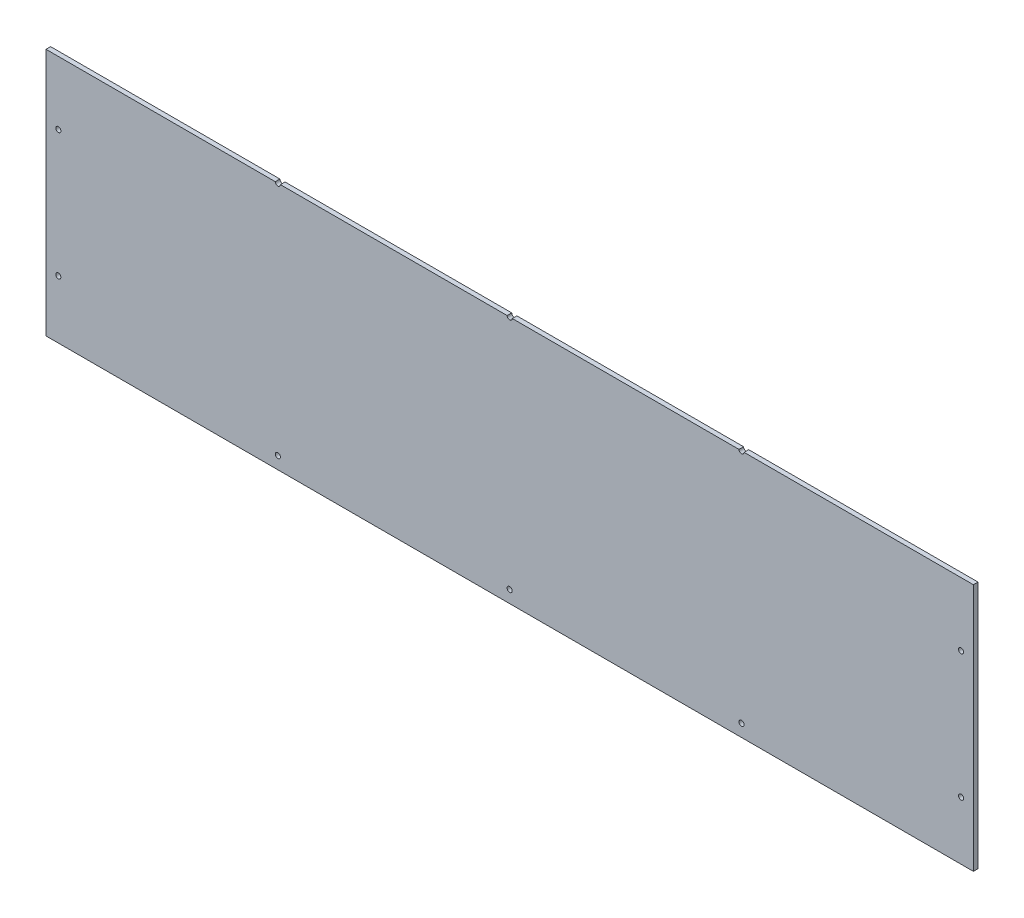
ISO-10303-21;
HEADER;
FILE_DESCRIPTION(('STEP AP214'),'2;1');
FILE_NAME('part.step','',(''),(''),'','','');
FILE_SCHEMA(('AUTOMOTIVE_DESIGN { 1 0 10303 214 1 1 1 1 }'));
ENDSEC;
DATA;
#1=APPLICATION_CONTEXT('core data for automotive mechanical design processes');
#2=APPLICATION_PROTOCOL_DEFINITION('international standard','automotive_design',2000,#1);
#3=PRODUCT_CONTEXT('',#1,'mechanical');
#4=PRODUCT('Part','Part','',(#3));
#5=PRODUCT_RELATED_PRODUCT_CATEGORY('part','',(#4));
#6=PRODUCT_DEFINITION_FORMATION('','',#4);
#7=PRODUCT_DEFINITION_CONTEXT('part definition',#1,'design');
#8=PRODUCT_DEFINITION('design','',#6,#7);
#9=PRODUCT_DEFINITION_SHAPE('','',#8);
#10=(LENGTH_UNIT() NAMED_UNIT(*) SI_UNIT(.MILLI.,.METRE.));
#11=(NAMED_UNIT(*) PLANE_ANGLE_UNIT() SI_UNIT($,.RADIAN.));
#12=(NAMED_UNIT(*) SI_UNIT($,.STERADIAN.) SOLID_ANGLE_UNIT());
#13=UNCERTAINTY_MEASURE_WITH_UNIT(LENGTH_MEASURE(1.E-05),#10,'distance_accuracy_value','');
#14=(GEOMETRIC_REPRESENTATION_CONTEXT(3) GLOBAL_UNCERTAINTY_ASSIGNED_CONTEXT((#13)) GLOBAL_UNIT_ASSIGNED_CONTEXT((#10,
#11,#12)) REPRESENTATION_CONTEXT('',''));
#15=CARTESIAN_POINT('',(0.,0.,0.));
#16=DIRECTION('',(0.,0.,1.));
#17=DIRECTION('',(1.,0.,0.));
#18=AXIS2_PLACEMENT_3D('',#15,#16,#17);
#19=CARTESIAN_POINT('',(-226.,123.499999999998,4.5));
#20=DIRECTION('',(0.,0.,1.));
#21=DIRECTION('',(1.,0.,0.));
#22=AXIS2_PLACEMENT_3D('',#19,#20,#21);
#23=PLANE('',#22);
#24=CARTESIAN_POINT('',(226.,-106.499999999998,4.5));
#25=DIRECTION('',(0.,0.,1.));
#26=DIRECTION('',(1.,0.,0.));
#27=AXIS2_PLACEMENT_3D('',#24,#25,#26);
#28=CIRCLE('',#27,2.5);
#29=CARTESIAN_POINT('',(228.5,-106.499999999998,4.5));
#30=VERTEX_POINT('',#29);
#31=EDGE_CURVE('E281',#30,#30,#28,.T.);
#32=ORIENTED_EDGE('',*,*,#31,.F.);
#33=EDGE_LOOP('',(#32));
#34=FACE_BOUND('',#33,.T.);
#35=CARTESIAN_POINT('',(440.,61.7500000000001,4.5));
#36=DIRECTION('',(0.,0.,1.));
#37=DIRECTION('',(-1.,0.,0.));
#38=AXIS2_PLACEMENT_3D('',#35,#36,#37);
#39=CIRCLE('',#38,2.50000000000002);
#40=CARTESIAN_POINT('',(437.5,61.7500000000001,4.5));
#41=VERTEX_POINT('',#40);
#42=EDGE_CURVE('E265',#41,#41,#39,.T.);
#43=ORIENTED_EDGE('',*,*,#42,.F.);
#44=EDGE_LOOP('',(#43));
#45=FACE_BOUND('',#44,.T.);
#46=CARTESIAN_POINT('',(439.999999999999,-61.7499999999999,4.5));
#47=DIRECTION('',(0.,0.,1.));
#48=DIRECTION('',(-1.,0.,0.));
#49=AXIS2_PLACEMENT_3D('',#46,#47,#48);
#50=CIRCLE('',#49,2.50000000000002);
#51=CARTESIAN_POINT('',(437.499999999999,-61.7499999999999,4.5));
#52=VERTEX_POINT('',#51);
#53=EDGE_CURVE('E249',#52,#52,#50,.T.);
#54=ORIENTED_EDGE('',*,*,#53,.F.);
#55=EDGE_LOOP('',(#54));
#56=FACE_BOUND('',#55,.T.);
#57=DIRECTION('',(-1.,0.,0.));
#58=VECTOR('',#57,1.);
#59=CARTESIAN_POINT('',(-452.000000000001,123.499999999997,4.5));
#60=LINE('',#59,#58);
#61=CARTESIAN_POINT('',(-228.5,123.499999999998,4.5));
#62=VERTEX_POINT('',#61);
#63=CARTESIAN_POINT('',(-452.000000000001,123.499999999997,4.5));
#64=VERTEX_POINT('',#63);
#65=EDGE_CURVE('E182',#62,#64,#60,.T.);
#66=ORIENTED_EDGE('',*,*,#65,.T.);
#67=DIRECTION('',(0.,-1.,0.));
#68=VECTOR('',#67,1.);
#69=CARTESIAN_POINT('',(-452.000000000001,123.499999999997,4.5));
#70=LINE('',#69,#68);
#71=CARTESIAN_POINT('',(-451.999999999999,-118.5,4.5));
#72=VERTEX_POINT('',#71);
#73=EDGE_CURVE('E106',#64,#72,#70,.T.);
#74=ORIENTED_EDGE('',*,*,#73,.T.);
#75=DIRECTION('',(1.,0.,0.));
#76=VECTOR('',#75,1.);
#77=CARTESIAN_POINT('',(-451.999999999999,-118.5,4.5));
#78=LINE('',#77,#76);
#79=CARTESIAN_POINT('',(452.000000000001,-118.499999999997,4.5));
#80=VERTEX_POINT('',#79);
#81=EDGE_CURVE('E211',#72,#80,#78,.T.);
#82=ORIENTED_EDGE('',*,*,#81,.T.);
#83=DIRECTION('',(0.,1.,0.));
#84=VECTOR('',#83,1.);
#85=CARTESIAN_POINT('',(451.999999999999,123.500000000003,4.5));
#86=LINE('',#85,#84);
#87=CARTESIAN_POINT('',(451.999999999999,123.500000000003,4.5));
#88=VERTEX_POINT('',#87);
#89=EDGE_CURVE('E231',#80,#88,#86,.T.);
#90=ORIENTED_EDGE('',*,*,#89,.T.);
#91=DIRECTION('',(-1.,0.,0.));
#92=VECTOR('',#91,1.);
#93=CARTESIAN_POINT('',(228.5,123.5,4.5));
#94=LINE('',#93,#92);
#95=CARTESIAN_POINT('',(228.5,123.5,4.5));
#96=VERTEX_POINT('',#95);
#97=EDGE_CURVE('E227',#88,#96,#94,.T.);
#98=ORIENTED_EDGE('',*,*,#97,.T.);
#99=CARTESIAN_POINT('',(226.,123.5,4.5));
#100=DIRECTION('',(0.,0.,-1.));
#101=DIRECTION('',(1.,0.,0.));
#102=AXIS2_PLACEMENT_3D('',#99,#100,#101);
#103=CIRCLE('',#102,2.5);
#104=CARTESIAN_POINT('',(223.5,123.5,4.5));
#105=VERTEX_POINT('',#104);
#106=EDGE_CURVE('E230',#96,#105,#103,.T.);
#107=ORIENTED_EDGE('',*,*,#106,.T.);
#108=DIRECTION('',(-1.,0.,0.));
#109=VECTOR('',#108,1.);
#110=CARTESIAN_POINT('',(2.50000000000006,123.5,4.5));
#111=LINE('',#110,#109);
#112=CARTESIAN_POINT('',(2.50000000000006,123.5,4.5));
#113=VERTEX_POINT('',#112);
#114=EDGE_CURVE('E131',#105,#113,#111,.T.);
#115=ORIENTED_EDGE('',*,*,#114,.T.);
#116=CARTESIAN_POINT('',(-7.51373588231738E-13,123.5,4.5));
#117=DIRECTION('',(0.,0.,-1.));
#118=DIRECTION('',(1.,0.,0.));
#119=AXIS2_PLACEMENT_3D('',#116,#117,#118);
#120=CIRCLE('',#119,2.5);
#121=CARTESIAN_POINT('',(-2.50000000000075,123.5,4.5));
#122=VERTEX_POINT('',#121);
#123=EDGE_CURVE('E125',#113,#122,#120,.T.);
#124=ORIENTED_EDGE('',*,*,#123,.T.);
#125=DIRECTION('',(-1.,0.,0.));
#126=VECTOR('',#125,1.);
#127=CARTESIAN_POINT('',(-223.5,123.499999999998,4.5));
#128=LINE('',#127,#126);
#129=CARTESIAN_POINT('',(-223.5,123.499999999998,4.5));
#130=VERTEX_POINT('',#129);
#131=EDGE_CURVE('E129',#122,#130,#128,.T.);
#132=ORIENTED_EDGE('',*,*,#131,.T.);
#133=CARTESIAN_POINT('',(-226.,123.499999999998,4.5));
#134=DIRECTION('',(0.,0.,-1.));
#135=DIRECTION('',(1.,0.,0.));
#136=AXIS2_PLACEMENT_3D('',#133,#134,#135);
#137=CIRCLE('',#136,2.5);
#138=EDGE_CURVE('E57',#130,#62,#137,.T.);
#139=ORIENTED_EDGE('',*,*,#138,.T.);
#140=EDGE_LOOP('',(#66,#74,#82,#90,#98,#107,#115,#124,#132,#139));
#141=FACE_BOUND('',#140,.T.);
#142=CARTESIAN_POINT('',(-440.,61.7500000000001,4.5));
#143=DIRECTION('',(0.,0.,1.));
#144=DIRECTION('',(1.,0.,0.));
#145=AXIS2_PLACEMENT_3D('',#142,#143,#144);
#146=CIRCLE('',#145,2.50000000000002);
#147=CARTESIAN_POINT('',(-437.5,61.7500000000001,4.5));
#148=VERTEX_POINT('',#147);
#149=EDGE_CURVE('E158',#148,#148,#146,.T.);
#150=ORIENTED_EDGE('',*,*,#149,.F.);
#151=EDGE_LOOP('',(#150));
#152=FACE_BOUND('',#151,.T.);
#153=CARTESIAN_POINT('',(-439.999999999999,-61.7499999999999,4.5));
#154=DIRECTION('',(0.,0.,1.));
#155=DIRECTION('',(1.,0.,0.));
#156=AXIS2_PLACEMENT_3D('',#153,#154,#155);
#157=CIRCLE('',#156,2.50000000000002);
#158=CARTESIAN_POINT('',(-437.499999999999,-61.7499999999999,4.5));
#159=VERTEX_POINT('',#158);
#160=EDGE_CURVE('E257',#159,#159,#157,.T.);
#161=ORIENTED_EDGE('',*,*,#160,.F.);
#162=EDGE_LOOP('',(#161));
#163=FACE_BOUND('',#162,.T.);
#164=CARTESIAN_POINT('',(0.,-106.499999999998,4.5));
#165=DIRECTION('',(0.,0.,1.));
#166=DIRECTION('',(1.,0.,0.));
#167=AXIS2_PLACEMENT_3D('',#164,#165,#166);
#168=CIRCLE('',#167,2.5);
#169=CARTESIAN_POINT('',(2.50000000000005,-106.499999999998,4.5));
#170=VERTEX_POINT('',#169);
#171=EDGE_CURVE('E273',#170,#170,#168,.T.);
#172=ORIENTED_EDGE('',*,*,#171,.F.);
#173=EDGE_LOOP('',(#172));
#174=FACE_BOUND('',#173,.T.);
#175=CARTESIAN_POINT('',(-226.,-106.5,4.5));
#176=DIRECTION('',(0.,0.,1.));
#177=DIRECTION('',(1.,0.,0.));
#178=AXIS2_PLACEMENT_3D('',#175,#176,#177);
#179=CIRCLE('',#178,2.5);
#180=CARTESIAN_POINT('',(-223.5,-106.5,4.5));
#181=VERTEX_POINT('',#180);
#182=EDGE_CURVE('E289',#181,#181,#179,.T.);
#183=ORIENTED_EDGE('',*,*,#182,.F.);
#184=EDGE_LOOP('',(#183));
#185=FACE_BOUND('',#184,.T.);
#186=ADVANCED_FACE('F39',(#34,#45,#56,#141,#152,#163,#174,#185),#23,.T.);
#187=CARTESIAN_POINT('',(-226.,123.499999999998,0.));
#188=DIRECTION('',(0.,0.,1.));
#189=DIRECTION('',(1.,0.,0.));
#190=AXIS2_PLACEMENT_3D('',#187,#188,#189);
#191=PLANE('',#190);
#192=DIRECTION('',(-1.,0.,0.));
#193=VECTOR('',#192,1.);
#194=CARTESIAN_POINT('',(-452.000000000001,123.499999999997,0.));
#195=LINE('',#194,#193);
#196=CARTESIAN_POINT('',(-228.5,123.499999999998,0.));
#197=VERTEX_POINT('',#196);
#198=CARTESIAN_POINT('',(-452.000000000001,123.499999999997,0.));
#199=VERTEX_POINT('',#198);
#200=EDGE_CURVE('E153',#197,#199,#195,.T.);
#201=ORIENTED_EDGE('',*,*,#200,.F.);
#202=CARTESIAN_POINT('',(-226.,123.499999999998,0.));
#203=DIRECTION('',(0.,0.,-1.));
#204=DIRECTION('',(1.,0.,0.));
#205=AXIS2_PLACEMENT_3D('',#202,#203,#204);
#206=CIRCLE('',#205,2.5);
#207=CARTESIAN_POINT('',(-223.5,123.499999999998,0.));
#208=VERTEX_POINT('',#207);
#209=EDGE_CURVE('E98',#208,#197,#206,.T.);
#210=ORIENTED_EDGE('',*,*,#209,.F.);
#211=DIRECTION('',(-1.,0.,0.));
#212=VECTOR('',#211,1.);
#213=CARTESIAN_POINT('',(-223.5,123.499999999998,0.));
#214=LINE('',#213,#212);
#215=CARTESIAN_POINT('',(-2.50000000000075,123.5,0.));
#216=VERTEX_POINT('',#215);
#217=EDGE_CURVE('E92',#216,#208,#214,.T.);
#218=ORIENTED_EDGE('',*,*,#217,.F.);
#219=CARTESIAN_POINT('',(-7.51373588231738E-13,123.5,0.));
#220=DIRECTION('',(0.,0.,-1.));
#221=DIRECTION('',(1.,0.,0.));
#222=AXIS2_PLACEMENT_3D('',#219,#220,#221);
#223=CIRCLE('',#222,2.5);
#224=CARTESIAN_POINT('',(2.50000000000006,123.5,0.));
#225=VERTEX_POINT('',#224);
#226=EDGE_CURVE('E140',#225,#216,#223,.T.);
#227=ORIENTED_EDGE('',*,*,#226,.F.);
#228=DIRECTION('',(-1.,0.,0.));
#229=VECTOR('',#228,1.);
#230=CARTESIAN_POINT('',(2.50000000000006,123.5,0.));
#231=LINE('',#230,#229);
#232=CARTESIAN_POINT('',(223.5,123.5,0.));
#233=VERTEX_POINT('',#232);
#234=EDGE_CURVE('E173',#233,#225,#231,.T.);
#235=ORIENTED_EDGE('',*,*,#234,.F.);
#236=CARTESIAN_POINT('',(226.,123.5,0.));
#237=DIRECTION('',(0.,0.,-1.));
#238=DIRECTION('',(1.,0.,0.));
#239=AXIS2_PLACEMENT_3D('',#236,#237,#238);
#240=CIRCLE('',#239,2.5);
#241=CARTESIAN_POINT('',(228.5,123.5,0.));
#242=VERTEX_POINT('',#241);
#243=EDGE_CURVE('E170',#242,#233,#240,.T.);
#244=ORIENTED_EDGE('',*,*,#243,.F.);
#245=DIRECTION('',(-1.,0.,0.));
#246=VECTOR('',#245,1.);
#247=CARTESIAN_POINT('',(228.5,123.5,0.));
#248=LINE('',#247,#246);
#249=CARTESIAN_POINT('',(451.999999999999,123.500000000003,0.));
#250=VERTEX_POINT('',#249);
#251=EDGE_CURVE('E167',#250,#242,#248,.T.);
#252=ORIENTED_EDGE('',*,*,#251,.F.);
#253=DIRECTION('',(0.,1.,0.));
#254=VECTOR('',#253,1.);
#255=CARTESIAN_POINT('',(451.999999999999,123.500000000003,0.));
#256=LINE('',#255,#254);
#257=CARTESIAN_POINT('',(452.000000000001,-118.499999999997,0.));
#258=VERTEX_POINT('',#257);
#259=EDGE_CURVE('E164',#258,#250,#256,.T.);
#260=ORIENTED_EDGE('',*,*,#259,.F.);
#261=DIRECTION('',(1.,0.,0.));
#262=VECTOR('',#261,1.);
#263=CARTESIAN_POINT('',(-451.999999999999,-118.5,0.));
#264=LINE('',#263,#262);
#265=CARTESIAN_POINT('',(-451.999999999999,-118.5,0.));
#266=VERTEX_POINT('',#265);
#267=EDGE_CURVE('E161',#266,#258,#264,.T.);
#268=ORIENTED_EDGE('',*,*,#267,.F.);
#269=DIRECTION('',(0.,-1.,0.));
#270=VECTOR('',#269,1.);
#271=CARTESIAN_POINT('',(-452.000000000001,123.499999999997,0.));
#272=LINE('',#271,#270);
#273=EDGE_CURVE('E157',#199,#266,#272,.T.);
#274=ORIENTED_EDGE('',*,*,#273,.F.);
#275=EDGE_LOOP('',(#201,#210,#218,#227,#235,#244,#252,#260,#268,#274));
#276=FACE_BOUND('',#275,.T.);
#277=CARTESIAN_POINT('',(-440.,61.7500000000001,0.));
#278=DIRECTION('',(0.,0.,1.));
#279=DIRECTION('',(1.,0.,0.));
#280=AXIS2_PLACEMENT_3D('',#277,#278,#279);
#281=CIRCLE('',#280,2.50000000000002);
#282=CARTESIAN_POINT('',(-437.5,61.7500000000001,0.));
#283=VERTEX_POINT('',#282);
#284=EDGE_CURVE('E245',#283,#283,#281,.T.);
#285=ORIENTED_EDGE('',*,*,#284,.T.);
#286=EDGE_LOOP('',(#285));
#287=FACE_BOUND('',#286,.T.);
#288=CARTESIAN_POINT('',(439.999999999999,-61.7499999999999,0.));
#289=DIRECTION('',(0.,0.,1.));
#290=DIRECTION('',(-1.,0.,0.));
#291=AXIS2_PLACEMENT_3D('',#288,#289,#290);
#292=CIRCLE('',#291,2.50000000000002);
#293=CARTESIAN_POINT('',(437.499999999999,-61.7499999999999,0.));
#294=VERTEX_POINT('',#293);
#295=EDGE_CURVE('E253',#294,#294,#292,.T.);
#296=ORIENTED_EDGE('',*,*,#295,.T.);
#297=EDGE_LOOP('',(#296));
#298=FACE_BOUND('',#297,.T.);
#299=CARTESIAN_POINT('',(-439.999999999999,-61.7499999999999,0.));
#300=DIRECTION('',(0.,0.,1.));
#301=DIRECTION('',(1.,0.,0.));
#302=AXIS2_PLACEMENT_3D('',#299,#300,#301);
#303=CIRCLE('',#302,2.50000000000002);
#304=CARTESIAN_POINT('',(-437.499999999999,-61.7499999999999,0.));
#305=VERTEX_POINT('',#304);
#306=EDGE_CURVE('E261',#305,#305,#303,.T.);
#307=ORIENTED_EDGE('',*,*,#306,.T.);
#308=EDGE_LOOP('',(#307));
#309=FACE_BOUND('',#308,.T.);
#310=CARTESIAN_POINT('',(440.,61.7500000000001,0.));
#311=DIRECTION('',(0.,0.,1.));
#312=DIRECTION('',(-1.,0.,0.));
#313=AXIS2_PLACEMENT_3D('',#310,#311,#312);
#314=CIRCLE('',#313,2.50000000000002);
#315=CARTESIAN_POINT('',(437.5,61.7500000000001,0.));
#316=VERTEX_POINT('',#315);
#317=EDGE_CURVE('E269',#316,#316,#314,.T.);
#318=ORIENTED_EDGE('',*,*,#317,.T.);
#319=EDGE_LOOP('',(#318));
#320=FACE_BOUND('',#319,.T.);
#321=CARTESIAN_POINT('',(0.,-106.499999999998,0.));
#322=DIRECTION('',(0.,0.,1.));
#323=DIRECTION('',(1.,0.,0.));
#324=AXIS2_PLACEMENT_3D('',#321,#322,#323);
#325=CIRCLE('',#324,2.5);
#326=CARTESIAN_POINT('',(2.50000000000005,-106.499999999998,0.));
#327=VERTEX_POINT('',#326);
#328=EDGE_CURVE('E277',#327,#327,#325,.T.);
#329=ORIENTED_EDGE('',*,*,#328,.T.);
#330=EDGE_LOOP('',(#329));
#331=FACE_BOUND('',#330,.T.);
#332=CARTESIAN_POINT('',(226.,-106.499999999998,0.));
#333=DIRECTION('',(0.,0.,1.));
#334=DIRECTION('',(1.,0.,0.));
#335=AXIS2_PLACEMENT_3D('',#332,#333,#334);
#336=CIRCLE('',#335,2.5);
#337=CARTESIAN_POINT('',(228.5,-106.499999999998,0.));
#338=VERTEX_POINT('',#337);
#339=EDGE_CURVE('E285',#338,#338,#336,.T.);
#340=ORIENTED_EDGE('',*,*,#339,.T.);
#341=EDGE_LOOP('',(#340));
#342=FACE_BOUND('',#341,.T.);
#343=CARTESIAN_POINT('',(-226.,-106.5,0.));
#344=DIRECTION('',(0.,0.,1.));
#345=DIRECTION('',(1.,0.,0.));
#346=AXIS2_PLACEMENT_3D('',#343,#344,#345);
#347=CIRCLE('',#346,2.5);
#348=CARTESIAN_POINT('',(-223.5,-106.5,0.));
#349=VERTEX_POINT('',#348);
#350=EDGE_CURVE('E293',#349,#349,#347,.T.);
#351=ORIENTED_EDGE('',*,*,#350,.T.);
#352=EDGE_LOOP('',(#351));
#353=FACE_BOUND('',#352,.T.);
#354=ADVANCED_FACE('F215',(#276,#287,#298,#309,#320,#331,#342,#353),#191,.F.);
#355=CARTESIAN_POINT('',(-452.000000000001,123.499999999997,4.5));
#356=DIRECTION('',(0.,-1.,0.));
#357=DIRECTION('',(1.,0.,0.));
#358=AXIS2_PLACEMENT_3D('',#355,#356,#357);
#359=PLANE('',#358);
#360=ORIENTED_EDGE('',*,*,#200,.T.);
#361=DIRECTION('',(0.,0.,-1.));
#362=VECTOR('',#361,1.);
#363=CARTESIAN_POINT('',(-452.000000000001,123.499999999997,4.5));
#364=LINE('',#363,#362);
#365=EDGE_CURVE('E11',#64,#199,#364,.T.);
#366=ORIENTED_EDGE('',*,*,#365,.F.);
#367=ORIENTED_EDGE('',*,*,#65,.F.);
#368=DIRECTION('',(0.,0.,-1.));
#369=VECTOR('',#368,1.);
#370=CARTESIAN_POINT('',(-228.5,123.499999999998,4.5));
#371=LINE('',#370,#369);
#372=EDGE_CURVE('E149',#62,#197,#371,.T.);
#373=ORIENTED_EDGE('',*,*,#372,.T.);
#374=EDGE_LOOP('',(#360,#366,#367,#373));
#375=FACE_BOUND('',#374,.T.);
#376=ADVANCED_FACE('F41',(#375),#359,.F.);
#377=CARTESIAN_POINT('',(-452.000000000001,123.499999999997,4.5));
#378=DIRECTION('',(1.,0.,0.));
#379=DIRECTION('',(0.,1.,0.));
#380=AXIS2_PLACEMENT_3D('',#377,#378,#379);
#381=PLANE('',#380);
#382=ORIENTED_EDGE('',*,*,#273,.T.);
#383=DIRECTION('',(0.,0.,-1.));
#384=VECTOR('',#383,1.);
#385=CARTESIAN_POINT('',(-451.999999999999,-118.5,4.5));
#386=LINE('',#385,#384);
#387=EDGE_CURVE('E49',#72,#266,#386,.T.);
#388=ORIENTED_EDGE('',*,*,#387,.F.);
#389=ORIENTED_EDGE('',*,*,#73,.F.);
#390=ORIENTED_EDGE('',*,*,#365,.T.);
#391=EDGE_LOOP('',(#382,#388,#389,#390));
#392=FACE_BOUND('',#391,.T.);
#393=ADVANCED_FACE('F337',(#392),#381,.F.);
#394=CARTESIAN_POINT('',(-451.999999999999,-118.5,4.5));
#395=DIRECTION('',(0.,1.,0.));
#396=DIRECTION('',(-1.,0.,0.));
#397=AXIS2_PLACEMENT_3D('',#394,#395,#396);
#398=PLANE('',#397);
#399=ORIENTED_EDGE('',*,*,#267,.T.);
#400=DIRECTION('',(0.,0.,-1.));
#401=VECTOR('',#400,1.);
#402=CARTESIAN_POINT('',(452.000000000001,-118.499999999997,4.5));
#403=LINE('',#402,#401);
#404=EDGE_CURVE('E201',#80,#258,#403,.T.);
#405=ORIENTED_EDGE('',*,*,#404,.F.);
#406=ORIENTED_EDGE('',*,*,#81,.F.);
#407=ORIENTED_EDGE('',*,*,#387,.T.);
#408=EDGE_LOOP('',(#399,#405,#406,#407));
#409=FACE_BOUND('',#408,.T.);
#410=ADVANCED_FACE('F209',(#409),#398,.F.);
#411=CARTESIAN_POINT('',(451.999999999999,123.500000000003,4.5));
#412=DIRECTION('',(-1.,0.,0.));
#413=DIRECTION('',(0.,-1.,0.));
#414=AXIS2_PLACEMENT_3D('',#411,#412,#413);
#415=PLANE('',#414);
#416=ORIENTED_EDGE('',*,*,#259,.T.);
#417=DIRECTION('',(0.,0.,-1.));
#418=VECTOR('',#417,1.);
#419=CARTESIAN_POINT('',(451.999999999999,123.500000000003,4.5));
#420=LINE('',#419,#418);
#421=EDGE_CURVE('E197',#88,#250,#420,.T.);
#422=ORIENTED_EDGE('',*,*,#421,.F.);
#423=ORIENTED_EDGE('',*,*,#89,.F.);
#424=ORIENTED_EDGE('',*,*,#404,.T.);
#425=EDGE_LOOP('',(#416,#422,#423,#424));
#426=FACE_BOUND('',#425,.T.);
#427=ADVANCED_FACE('F221',(#426),#415,.F.);
#428=CARTESIAN_POINT('',(228.5,123.5,4.5));
#429=DIRECTION('',(0.,-1.,0.));
#430=DIRECTION('',(1.,0.,0.));
#431=AXIS2_PLACEMENT_3D('',#428,#429,#430);
#432=PLANE('',#431);
#433=ORIENTED_EDGE('',*,*,#251,.T.);
#434=DIRECTION('',(0.,0.,-1.));
#435=VECTOR('',#434,1.);
#436=CARTESIAN_POINT('',(228.5,123.5,4.5));
#437=LINE('',#436,#435);
#438=EDGE_CURVE('E193',#96,#242,#437,.T.);
#439=ORIENTED_EDGE('',*,*,#438,.F.);
#440=ORIENTED_EDGE('',*,*,#97,.F.);
#441=ORIENTED_EDGE('',*,*,#421,.T.);
#442=EDGE_LOOP('',(#433,#439,#440,#441));
#443=FACE_BOUND('',#442,.T.);
#444=ADVANCED_FACE('F225',(#443),#432,.F.);
#445=CARTESIAN_POINT('',(226.,123.5,4.5));
#446=DIRECTION('',(0.,0.,-1.));
#447=DIRECTION('',(-1.,0.,0.));
#448=AXIS2_PLACEMENT_3D('',#445,#446,#447);
#449=CYLINDRICAL_SURFACE('',#448,2.5);
#450=ORIENTED_EDGE('',*,*,#243,.T.);
#451=DIRECTION('',(0.,0.,-1.));
#452=VECTOR('',#451,1.);
#453=CARTESIAN_POINT('',(223.5,123.5,4.5));
#454=LINE('',#453,#452);
#455=EDGE_CURVE('E189',#105,#233,#454,.T.);
#456=ORIENTED_EDGE('',*,*,#455,.F.);
#457=ORIENTED_EDGE('',*,*,#106,.F.);
#458=ORIENTED_EDGE('',*,*,#438,.T.);
#459=EDGE_LOOP('',(#450,#456,#457,#458));
#460=FACE_BOUND('',#459,.T.);
#461=ADVANCED_FACE('F327',(#460),#449,.F.);
#462=CARTESIAN_POINT('',(2.50000000000006,123.5,4.5));
#463=DIRECTION('',(0.,-1.,0.));
#464=DIRECTION('',(0.,0.,-1.));
#465=AXIS2_PLACEMENT_3D('',#462,#463,#464);
#466=PLANE('',#465);
#467=ORIENTED_EDGE('',*,*,#234,.T.);
#468=DIRECTION('',(0.,0.,-1.));
#469=VECTOR('',#468,1.);
#470=CARTESIAN_POINT('',(2.50000000000006,123.5,4.5));
#471=LINE('',#470,#469);
#472=EDGE_CURVE('E142',#113,#225,#471,.T.);
#473=ORIENTED_EDGE('',*,*,#472,.F.);
#474=ORIENTED_EDGE('',*,*,#114,.F.);
#475=ORIENTED_EDGE('',*,*,#455,.T.);
#476=EDGE_LOOP('',(#467,#473,#474,#475));
#477=FACE_BOUND('',#476,.T.);
#478=ADVANCED_FACE('F324',(#477),#466,.F.);
#479=CARTESIAN_POINT('',(-7.51373588231738E-13,123.5,4.5));
#480=DIRECTION('',(0.,0.,-1.));
#481=DIRECTION('',(-1.,0.,0.));
#482=AXIS2_PLACEMENT_3D('',#479,#480,#481);
#483=CYLINDRICAL_SURFACE('',#482,2.5);
#484=ORIENTED_EDGE('',*,*,#226,.T.);
#485=DIRECTION('',(0.,0.,-1.));
#486=VECTOR('',#485,1.);
#487=CARTESIAN_POINT('',(-2.50000000000075,123.5,4.5));
#488=LINE('',#487,#486);
#489=EDGE_CURVE('E137',#122,#216,#488,.T.);
#490=ORIENTED_EDGE('',*,*,#489,.F.);
#491=ORIENTED_EDGE('',*,*,#123,.F.);
#492=ORIENTED_EDGE('',*,*,#472,.T.);
#493=EDGE_LOOP('',(#484,#490,#491,#492));
#494=FACE_BOUND('',#493,.T.);
#495=ADVANCED_FACE('F138',(#494),#483,.F.);
#496=CARTESIAN_POINT('',(-223.5,123.499999999998,4.5));
#497=DIRECTION('',(0.,-1.,0.));
#498=DIRECTION('',(1.,0.,0.));
#499=AXIS2_PLACEMENT_3D('',#496,#497,#498);
#500=PLANE('',#499);
#501=ORIENTED_EDGE('',*,*,#217,.T.);
#502=DIRECTION('',(0.,0.,-1.));
#503=VECTOR('',#502,1.);
#504=CARTESIAN_POINT('',(-223.5,123.499999999998,4.5));
#505=LINE('',#504,#503);
#506=EDGE_CURVE('E143',#130,#208,#505,.T.);
#507=ORIENTED_EDGE('',*,*,#506,.F.);
#508=ORIENTED_EDGE('',*,*,#131,.F.);
#509=ORIENTED_EDGE('',*,*,#489,.T.);
#510=EDGE_LOOP('',(#501,#507,#508,#509));
#511=FACE_BOUND('',#510,.T.);
#512=ADVANCED_FACE('F145',(#511),#500,.F.);
#513=CARTESIAN_POINT('',(-226.,123.499999999998,4.5));
#514=DIRECTION('',(0.,0.,-1.));
#515=DIRECTION('',(-1.,0.,0.));
#516=AXIS2_PLACEMENT_3D('',#513,#514,#515);
#517=CYLINDRICAL_SURFACE('',#516,2.5);
#518=ORIENTED_EDGE('',*,*,#209,.T.);
#519=ORIENTED_EDGE('',*,*,#372,.F.);
#520=ORIENTED_EDGE('',*,*,#138,.F.);
#521=ORIENTED_EDGE('',*,*,#506,.T.);
#522=EDGE_LOOP('',(#518,#519,#520,#521));
#523=FACE_BOUND('',#522,.T.);
#524=ADVANCED_FACE('F317',(#523),#517,.F.);
#525=CARTESIAN_POINT('',(-440.,61.7500000000001,4.5));
#526=DIRECTION('',(0.,0.,-1.));
#527=DIRECTION('',(-1.,0.,0.));
#528=AXIS2_PLACEMENT_3D('',#525,#526,#527);
#529=CYLINDRICAL_SURFACE('',#528,2.50000000000002);
#530=ORIENTED_EDGE('',*,*,#149,.T.);
#531=EDGE_LOOP('',(#530));
#532=FACE_BOUND('',#531,.T.);
#533=ORIENTED_EDGE('',*,*,#284,.F.);
#534=EDGE_LOOP('',(#533));
#535=FACE_BOUND('',#534,.T.);
#536=ADVANCED_FACE('F314',(#532,#535),#529,.F.);
#537=CARTESIAN_POINT('',(439.999999999999,-61.7499999999999,4.5));
#538=DIRECTION('',(0.,0.,-1.));
#539=DIRECTION('',(-1.,0.,0.));
#540=AXIS2_PLACEMENT_3D('',#537,#538,#539);
#541=CYLINDRICAL_SURFACE('',#540,2.50000000000002);
#542=ORIENTED_EDGE('',*,*,#53,.T.);
#543=EDGE_LOOP('',(#542));
#544=FACE_BOUND('',#543,.T.);
#545=ORIENTED_EDGE('',*,*,#295,.F.);
#546=EDGE_LOOP('',(#545));
#547=FACE_BOUND('',#546,.T.);
#548=ADVANCED_FACE('F413',(#544,#547),#541,.F.);
#549=CARTESIAN_POINT('',(-439.999999999999,-61.7499999999999,4.5));
#550=DIRECTION('',(0.,0.,-1.));
#551=DIRECTION('',(-1.,0.,0.));
#552=AXIS2_PLACEMENT_3D('',#549,#550,#551);
#553=CYLINDRICAL_SURFACE('',#552,2.50000000000002);
#554=ORIENTED_EDGE('',*,*,#160,.T.);
#555=EDGE_LOOP('',(#554));
#556=FACE_BOUND('',#555,.T.);
#557=ORIENTED_EDGE('',*,*,#306,.F.);
#558=EDGE_LOOP('',(#557));
#559=FACE_BOUND('',#558,.T.);
#560=ADVANCED_FACE('F421',(#556,#559),#553,.F.);
#561=CARTESIAN_POINT('',(440.,61.7500000000001,4.5));
#562=DIRECTION('',(0.,0.,-1.));
#563=DIRECTION('',(-1.,0.,0.));
#564=AXIS2_PLACEMENT_3D('',#561,#562,#563);
#565=CYLINDRICAL_SURFACE('',#564,2.50000000000002);
#566=ORIENTED_EDGE('',*,*,#42,.T.);
#567=EDGE_LOOP('',(#566));
#568=FACE_BOUND('',#567,.T.);
#569=ORIENTED_EDGE('',*,*,#317,.F.);
#570=EDGE_LOOP('',(#569));
#571=FACE_BOUND('',#570,.T.);
#572=ADVANCED_FACE('F429',(#568,#571),#565,.F.);
#573=CARTESIAN_POINT('',(0.,-106.499999999998,4.5));
#574=DIRECTION('',(0.,0.,-1.));
#575=DIRECTION('',(-1.,0.,0.));
#576=AXIS2_PLACEMENT_3D('',#573,#574,#575);
#577=CYLINDRICAL_SURFACE('',#576,2.5);
#578=ORIENTED_EDGE('',*,*,#171,.T.);
#579=EDGE_LOOP('',(#578));
#580=FACE_BOUND('',#579,.T.);
#581=ORIENTED_EDGE('',*,*,#328,.F.);
#582=EDGE_LOOP('',(#581));
#583=FACE_BOUND('',#582,.T.);
#584=ADVANCED_FACE('F438',(#580,#583),#577,.F.);
#585=CARTESIAN_POINT('',(226.,-106.499999999998,4.5));
#586=DIRECTION('',(0.,0.,-1.));
#587=DIRECTION('',(-1.,0.,0.));
#588=AXIS2_PLACEMENT_3D('',#585,#586,#587);
#589=CYLINDRICAL_SURFACE('',#588,2.5);
#590=ORIENTED_EDGE('',*,*,#31,.T.);
#591=EDGE_LOOP('',(#590));
#592=FACE_BOUND('',#591,.T.);
#593=ORIENTED_EDGE('',*,*,#339,.F.);
#594=EDGE_LOOP('',(#593));
#595=FACE_BOUND('',#594,.T.);
#596=ADVANCED_FACE('F447',(#592,#595),#589,.F.);
#597=CARTESIAN_POINT('',(-226.,-106.5,4.5));
#598=DIRECTION('',(0.,0.,-1.));
#599=DIRECTION('',(-1.,0.,0.));
#600=AXIS2_PLACEMENT_3D('',#597,#598,#599);
#601=CYLINDRICAL_SURFACE('',#600,2.5);
#602=ORIENTED_EDGE('',*,*,#182,.T.);
#603=EDGE_LOOP('',(#602));
#604=FACE_BOUND('',#603,.T.);
#605=ORIENTED_EDGE('',*,*,#350,.F.);
#606=EDGE_LOOP('',(#605));
#607=FACE_BOUND('',#606,.T.);
#608=ADVANCED_FACE('F301',(#604,#607),#601,.F.);
#609=CLOSED_SHELL('',(#186,#354,#376,#393,#410,#427,#444,#461,#478,#495,#512,#524,#536,#548,
#560,#572,#584,#596,#608));
#610=MANIFOLD_SOLID_BREP('B2',#609);
#611=ADVANCED_BREP_SHAPE_REPRESENTATION('',(#18,#610),#14);
#612=SHAPE_DEFINITION_REPRESENTATION(#9,#611);
ENDSEC;
END-ISO-10303-21;
